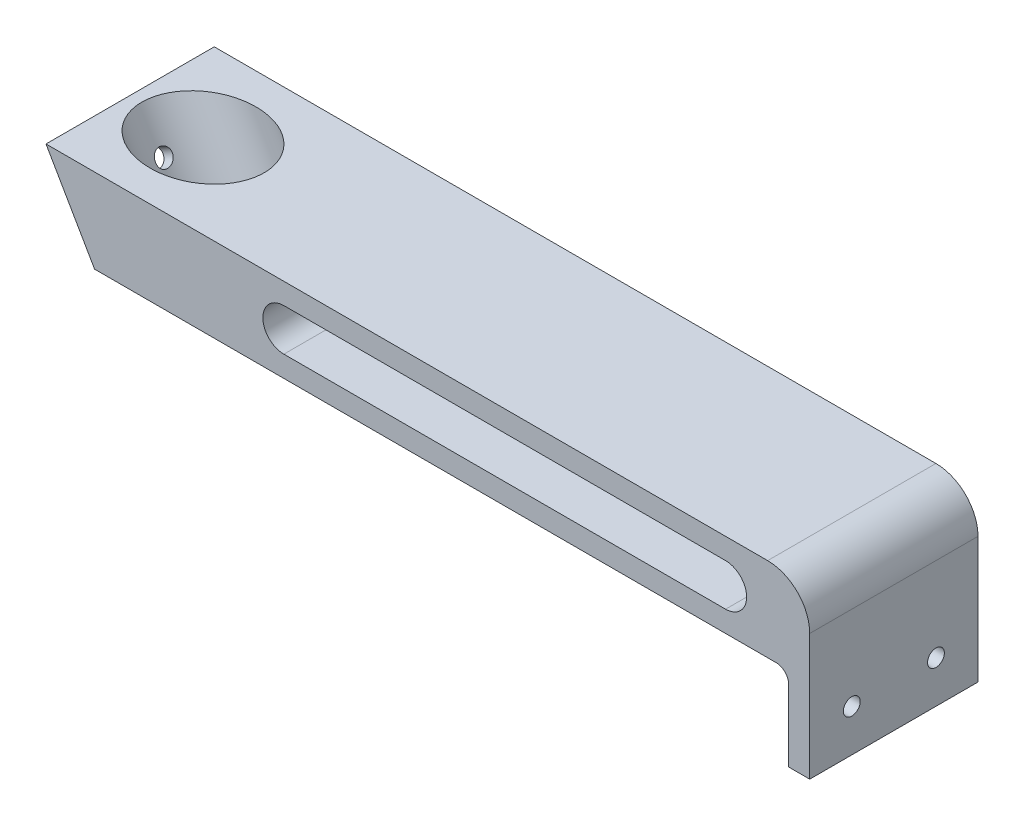
ISO-10303-21;
HEADER;
FILE_DESCRIPTION(('STEP AP214'),'2;1');
FILE_NAME('part.step','',(''),(''),'','','');
FILE_SCHEMA(('AUTOMOTIVE_DESIGN { 1 0 10303 214 1 1 1 1 }'));
ENDSEC;
DATA;
#1=APPLICATION_CONTEXT('core data for automotive mechanical design processes');
#2=APPLICATION_PROTOCOL_DEFINITION('international standard','automotive_design',2000,#1);
#3=PRODUCT_CONTEXT('',#1,'mechanical');
#4=PRODUCT('Part','Part','',(#3));
#5=PRODUCT_RELATED_PRODUCT_CATEGORY('part','',(#4));
#6=PRODUCT_DEFINITION_FORMATION('','',#4);
#7=PRODUCT_DEFINITION_CONTEXT('part definition',#1,'design');
#8=PRODUCT_DEFINITION('design','',#6,#7);
#9=PRODUCT_DEFINITION_SHAPE('','',#8);
#10=(LENGTH_UNIT() NAMED_UNIT(*) SI_UNIT(.MILLI.,.METRE.));
#11=(NAMED_UNIT(*) PLANE_ANGLE_UNIT() SI_UNIT($,.RADIAN.));
#12=(NAMED_UNIT(*) SI_UNIT($,.STERADIAN.) SOLID_ANGLE_UNIT());
#13=UNCERTAINTY_MEASURE_WITH_UNIT(LENGTH_MEASURE(1.E-05),#10,'distance_accuracy_value','');
#14=(GEOMETRIC_REPRESENTATION_CONTEXT(3) GLOBAL_UNCERTAINTY_ASSIGNED_CONTEXT((#13)) GLOBAL_UNIT_ASSIGNED_CONTEXT((#10,
#11,#12)) REPRESENTATION_CONTEXT('',''));
#15=CARTESIAN_POINT('',(0.,0.,0.));
#16=DIRECTION('',(0.,0.,1.));
#17=DIRECTION('',(1.,0.,0.));
#18=AXIS2_PLACEMENT_3D('',#15,#16,#17);
#19=CARTESIAN_POINT('',(0.,0.,40.));
#20=DIRECTION('',(0.,1.,0.));
#21=DIRECTION('',(0.,0.,1.));
#22=AXIS2_PLACEMENT_3D('',#19,#20,#21);
#23=PLANE('',#22);
#24=CARTESIAN_POINT('',(17.3205080756887,0.,20.));
#25=DIRECTION('',(0.,1.,0.));
#26=DIRECTION('',(-1.,0.,0.));
#27=AXIS2_PLACEMENT_3D('',#24,#25,#26);
#28=ELLIPSE('',#27,14.5492267835785,12.6);
#29=CARTESIAN_POINT('',(2.77128129211019,0.,20.));
#30=VERTEX_POINT('',#29);
#31=EDGE_CURVE('E228',#30,#30,#28,.T.);
#32=ORIENTED_EDGE('',*,*,#31,.T.);
#33=EDGE_LOOP('',(#32));
#34=FACE_BOUND('',#33,.T.);
#35=DIRECTION('',(1.,0.,0.));
#36=VECTOR('',#35,1.);
#37=CARTESIAN_POINT('',(0.,0.,0.));
#38=LINE('',#37,#36);
#39=CARTESIAN_POINT('',(0.,0.,0.));
#40=VERTEX_POINT('',#39);
#41=CARTESIAN_POINT('',(162.,0.,0.));
#42=VERTEX_POINT('',#41);
#43=EDGE_CURVE('E312',#40,#42,#38,.T.);
#44=ORIENTED_EDGE('',*,*,#43,.T.);
#45=DIRECTION('',(0.,0.,-1.));
#46=VECTOR('',#45,1.);
#47=CARTESIAN_POINT('',(162.,0.,40.));
#48=LINE('',#47,#46);
#49=CARTESIAN_POINT('',(162.,0.,40.));
#50=VERTEX_POINT('',#49);
#51=EDGE_CURVE('E299',#42,#50,#48,.F.);
#52=ORIENTED_EDGE('',*,*,#51,.T.);
#53=DIRECTION('',(1.,0.,0.));
#54=VECTOR('',#53,1.);
#55=CARTESIAN_POINT('',(0.,0.,40.));
#56=LINE('',#55,#54);
#57=CARTESIAN_POINT('',(0.,0.,40.));
#58=VERTEX_POINT('',#57);
#59=EDGE_CURVE('E331',#58,#50,#56,.T.);
#60=ORIENTED_EDGE('',*,*,#59,.F.);
#61=DIRECTION('',(0.,0.,-1.));
#62=VECTOR('',#61,1.);
#63=CARTESIAN_POINT('',(0.,0.,40.));
#64=LINE('',#63,#62);
#65=EDGE_CURVE('E320',#58,#40,#64,.T.);
#66=ORIENTED_EDGE('',*,*,#65,.T.);
#67=EDGE_LOOP('',(#44,#52,#60,#66));
#68=FACE_BOUND('',#67,.T.);
#69=ADVANCED_FACE('F39',(#34,#68),#23,.F.);
#70=CARTESIAN_POINT('',(-11.5470053837923,20.,40.));
#71=DIRECTION('',(0.866025403784442,0.499999999999995,0.));
#72=DIRECTION('',(-0.499999999999995,0.866025403784442,0.));
#73=AXIS2_PLACEMENT_3D('',#70,#71,#72);
#74=PLANE('',#73);
#75=CARTESIAN_POINT('',(-5.73361648017728,9.93091505478142,20.));
#76=DIRECTION('',(-0.866025403784442,-0.499999999999995,0.));
#77=DIRECTION('',(0.499999999999995,-0.866025403784442,0.));
#78=AXIS2_PLACEMENT_3D('',#75,#76,#77);
#79=CIRCLE('',#78,2.);
#80=CARTESIAN_POINT('',(-4.73361648017729,8.19886424721254,20.));
#81=VERTEX_POINT('',#80);
#82=EDGE_CURVE('E214',#81,#81,#79,.T.);
#83=ORIENTED_EDGE('',*,*,#82,.F.);
#84=EDGE_LOOP('',(#83));
#85=FACE_BOUND('',#84,.T.);
#86=DIRECTION('',(0.499999999999995,-0.866025403784442,0.));
#87=VECTOR('',#86,1.);
#88=CARTESIAN_POINT('',(-11.5470053837923,20.,0.));
#89=LINE('',#88,#87);
#90=CARTESIAN_POINT('',(-11.5470053837923,20.,0.));
#91=VERTEX_POINT('',#90);
#92=EDGE_CURVE('E324',#91,#40,#89,.T.);
#93=ORIENTED_EDGE('',*,*,#92,.T.);
#94=ORIENTED_EDGE('',*,*,#65,.F.);
#95=DIRECTION('',(0.499999999999995,-0.866025403784442,0.));
#96=VECTOR('',#95,1.);
#97=CARTESIAN_POINT('',(-11.5470053837923,20.,40.));
#98=LINE('',#97,#96);
#99=CARTESIAN_POINT('',(-11.5470053837923,20.,40.));
#100=VERTEX_POINT('',#99);
#101=EDGE_CURVE('E343',#100,#58,#98,.T.);
#102=ORIENTED_EDGE('',*,*,#101,.F.);
#103=DIRECTION('',(0.,0.,-1.));
#104=VECTOR('',#103,1.);
#105=CARTESIAN_POINT('',(-11.5470053837923,20.,40.));
#106=LINE('',#105,#104);
#107=EDGE_CURVE('E341',#100,#91,#106,.T.);
#108=ORIENTED_EDGE('',*,*,#107,.T.);
#109=EDGE_LOOP('',(#93,#94,#102,#108));
#110=FACE_BOUND('',#109,.T.);
#111=ADVANCED_FACE('F265',(#85,#110),#74,.F.);
#112=CARTESIAN_POINT('',(170.,0.,40.));
#113=DIRECTION('',(-1.,0.,0.));
#114=DIRECTION('',(0.,0.,1.));
#115=AXIS2_PLACEMENT_3D('',#112,#113,#114);
#116=PLANE('',#115);
#117=CARTESIAN_POINT('',(170.,-10.,10.));
#118=DIRECTION('',(-1.,0.,0.));
#119=DIRECTION('',(0.,0.,1.));
#120=AXIS2_PLACEMENT_3D('',#117,#118,#119);
#121=CIRCLE('',#120,2.);
#122=CARTESIAN_POINT('',(170.,-10.,12.));
#123=VERTEX_POINT('',#122);
#124=EDGE_CURVE('E177',#123,#123,#121,.T.);
#125=ORIENTED_EDGE('',*,*,#124,.T.);
#126=EDGE_LOOP('',(#125));
#127=FACE_BOUND('',#126,.T.);
#128=CARTESIAN_POINT('',(170.,-10.,30.));
#129=DIRECTION('',(-1.,0.,0.));
#130=DIRECTION('',(0.,0.,-1.));
#131=AXIS2_PLACEMENT_3D('',#128,#129,#130);
#132=CIRCLE('',#131,2.);
#133=CARTESIAN_POINT('',(170.,-10.,28.));
#134=VERTEX_POINT('',#133);
#135=EDGE_CURVE('E186',#134,#134,#132,.T.);
#136=ORIENTED_EDGE('',*,*,#135,.T.);
#137=EDGE_LOOP('',(#136));
#138=FACE_BOUND('',#137,.T.);
#139=DIRECTION('',(0.,1.,0.));
#140=VECTOR('',#139,1.);
#141=CARTESIAN_POINT('',(170.,0.,0.));
#142=LINE('',#141,#140);
#143=CARTESIAN_POINT('',(170.,-20.,0.));
#144=VERTEX_POINT('',#143);
#145=CARTESIAN_POINT('',(170.,9.99999999999999,0.));
#146=VERTEX_POINT('',#145);
#147=EDGE_CURVE('E323',#144,#146,#142,.T.);
#148=ORIENTED_EDGE('',*,*,#147,.T.);
#149=DIRECTION('',(0.,0.,-1.));
#150=VECTOR('',#149,1.);
#151=CARTESIAN_POINT('',(170.,9.99999999999999,40.));
#152=LINE('',#151,#150);
#153=CARTESIAN_POINT('',(170.,9.99999999999999,40.));
#154=VERTEX_POINT('',#153);
#155=EDGE_CURVE('E288',#146,#154,#152,.F.);
#156=ORIENTED_EDGE('',*,*,#155,.T.);
#157=DIRECTION('',(0.,1.,0.));
#158=VECTOR('',#157,1.);
#159=CARTESIAN_POINT('',(170.,0.,40.));
#160=LINE('',#159,#158);
#161=CARTESIAN_POINT('',(170.,-20.,40.));
#162=VERTEX_POINT('',#161);
#163=EDGE_CURVE('E334',#162,#154,#160,.T.);
#164=ORIENTED_EDGE('',*,*,#163,.F.);
#165=DIRECTION('',(0.,0.,1.));
#166=VECTOR('',#165,1.);
#167=CARTESIAN_POINT('',(170.,-20.,40.));
#168=LINE('',#167,#166);
#169=EDGE_CURVE('E181',#144,#162,#168,.T.);
#170=ORIENTED_EDGE('',*,*,#169,.F.);
#171=EDGE_LOOP('',(#148,#156,#164,#170));
#172=FACE_BOUND('',#171,.T.);
#173=ADVANCED_FACE('F271',(#127,#138,#172),#116,.F.);
#174=CARTESIAN_POINT('',(170.,20.,40.));
#175=DIRECTION('',(0.,-1.,0.));
#176=DIRECTION('',(1.,0.,0.));
#177=AXIS2_PLACEMENT_3D('',#174,#175,#176);
#178=PLANE('',#177);
#179=CARTESIAN_POINT('',(5.77350269189636,20.,20.));
#180=DIRECTION('',(0.,-1.,0.));
#181=DIRECTION('',(-1.,0.,0.));
#182=AXIS2_PLACEMENT_3D('',#179,#180,#181);
#183=ELLIPSE('',#182,14.5492267835785,12.6);
#184=CARTESIAN_POINT('',(-8.77572409168216,20.,20.));
#185=VERTEX_POINT('',#184);
#186=EDGE_CURVE('E227',#185,#185,#183,.T.);
#187=ORIENTED_EDGE('',*,*,#186,.T.);
#188=EDGE_LOOP('',(#187));
#189=FACE_BOUND('',#188,.T.);
#190=DIRECTION('',(-1.,0.,0.));
#191=VECTOR('',#190,1.);
#192=CARTESIAN_POINT('',(170.,20.,40.));
#193=LINE('',#192,#191);
#194=CARTESIAN_POINT('',(160.,20.,40.));
#195=VERTEX_POINT('',#194);
#196=EDGE_CURVE('E337',#195,#100,#193,.T.);
#197=ORIENTED_EDGE('',*,*,#196,.F.);
#198=DIRECTION('',(0.,0.,-1.));
#199=VECTOR('',#198,1.);
#200=CARTESIAN_POINT('',(160.,20.,40.));
#201=LINE('',#200,#199);
#202=CARTESIAN_POINT('',(160.,20.,0.));
#203=VERTEX_POINT('',#202);
#204=EDGE_CURVE('E290',#195,#203,#201,.T.);
#205=ORIENTED_EDGE('',*,*,#204,.T.);
#206=DIRECTION('',(-1.,0.,0.));
#207=VECTOR('',#206,1.);
#208=CARTESIAN_POINT('',(170.,20.,0.));
#209=LINE('',#208,#207);
#210=EDGE_CURVE('E351',#203,#91,#209,.T.);
#211=ORIENTED_EDGE('',*,*,#210,.T.);
#212=ORIENTED_EDGE('',*,*,#107,.F.);
#213=EDGE_LOOP('',(#197,#205,#211,#212));
#214=FACE_BOUND('',#213,.T.);
#215=ADVANCED_FACE('F365',(#189,#214),#178,.F.);
#216=CARTESIAN_POINT('',(0.,0.,40.));
#217=DIRECTION('',(0.,0.,1.));
#218=DIRECTION('',(1.,0.,0.));
#219=AXIS2_PLACEMENT_3D('',#216,#217,#218);
#220=PLANE('',#219);
#221=CARTESIAN_POINT('',(150.,10.,40.));
#222=DIRECTION('',(0.,0.,-1.));
#223=DIRECTION('',(-1.,0.,0.));
#224=AXIS2_PLACEMENT_3D('',#221,#222,#223);
#225=CIRCLE('',#224,5.);
#226=CARTESIAN_POINT('',(150.,15.,40.));
#227=VERTEX_POINT('',#226);
#228=CARTESIAN_POINT('',(150.,5.,40.));
#229=VERTEX_POINT('',#228);
#230=EDGE_CURVE('E130',#227,#229,#225,.T.);
#231=ORIENTED_EDGE('',*,*,#230,.T.);
#232=DIRECTION('',(-1.,0.,0.));
#233=VECTOR('',#232,1.);
#234=CARTESIAN_POINT('',(150.,5.,40.));
#235=LINE('',#234,#233);
#236=CARTESIAN_POINT('',(45.,5.,40.));
#237=VERTEX_POINT('',#236);
#238=EDGE_CURVE('E140',#229,#237,#235,.T.);
#239=ORIENTED_EDGE('',*,*,#238,.T.);
#240=CARTESIAN_POINT('',(45.,10.,40.));
#241=DIRECTION('',(0.,0.,-1.));
#242=DIRECTION('',(-1.,0.,0.));
#243=AXIS2_PLACEMENT_3D('',#240,#241,#242);
#244=CIRCLE('',#243,5.);
#245=CARTESIAN_POINT('',(45.,15.,40.));
#246=VERTEX_POINT('',#245);
#247=EDGE_CURVE('E55',#237,#246,#244,.T.);
#248=ORIENTED_EDGE('',*,*,#247,.T.);
#249=DIRECTION('',(1.,0.,0.));
#250=VECTOR('',#249,1.);
#251=CARTESIAN_POINT('',(150.,15.,40.));
#252=LINE('',#251,#250);
#253=EDGE_CURVE('E137',#246,#227,#252,.T.);
#254=ORIENTED_EDGE('',*,*,#253,.T.);
#255=EDGE_LOOP('',(#231,#239,#248,#254));
#256=FACE_BOUND('',#255,.T.);
#257=ORIENTED_EDGE('',*,*,#163,.T.);
#258=CARTESIAN_POINT('',(160.,9.99999999999999,40.));
#259=DIRECTION('',(0.,0.,1.));
#260=DIRECTION('',(1.,0.,0.));
#261=AXIS2_PLACEMENT_3D('',#258,#259,#260);
#262=CIRCLE('',#261,10.);
#263=EDGE_CURVE('E287',#154,#195,#262,.T.);
#264=ORIENTED_EDGE('',*,*,#263,.T.);
#265=ORIENTED_EDGE('',*,*,#196,.T.);
#266=ORIENTED_EDGE('',*,*,#101,.T.);
#267=ORIENTED_EDGE('',*,*,#59,.T.);
#268=CARTESIAN_POINT('',(162.,-3.,40.));
#269=DIRECTION('',(0.,0.,1.));
#270=DIRECTION('',(1.,0.,0.));
#271=AXIS2_PLACEMENT_3D('',#268,#269,#270);
#272=CIRCLE('',#271,3.);
#273=CARTESIAN_POINT('',(165.,-3.,40.));
#274=VERTEX_POINT('',#273);
#275=EDGE_CURVE('E11',#50,#274,#272,.F.);
#276=ORIENTED_EDGE('',*,*,#275,.T.);
#277=DIRECTION('',(0.,1.,0.));
#278=VECTOR('',#277,1.);
#279=CARTESIAN_POINT('',(165.,-20.,40.));
#280=LINE('',#279,#278);
#281=CARTESIAN_POINT('',(165.,-20.,40.));
#282=VERTEX_POINT('',#281);
#283=EDGE_CURVE('E210',#282,#274,#280,.T.);
#284=ORIENTED_EDGE('',*,*,#283,.F.);
#285=DIRECTION('',(-1.,0.,0.));
#286=VECTOR('',#285,1.);
#287=CARTESIAN_POINT('',(170.,-20.,40.));
#288=LINE('',#287,#286);
#289=EDGE_CURVE('E196',#162,#282,#288,.T.);
#290=ORIENTED_EDGE('',*,*,#289,.F.);
#291=EDGE_LOOP('',(#257,#264,#265,#266,#267,#276,#284,#290));
#292=FACE_BOUND('',#291,.T.);
#293=ADVANCED_FACE('F145',(#256,#292),#220,.T.);
#294=CARTESIAN_POINT('',(0.,0.,0.));
#295=DIRECTION('',(0.,0.,1.));
#296=DIRECTION('',(1.,0.,0.));
#297=AXIS2_PLACEMENT_3D('',#294,#295,#296);
#298=PLANE('',#297);
#299=DIRECTION('',(-1.,0.,0.));
#300=VECTOR('',#299,1.);
#301=CARTESIAN_POINT('',(150.,5.,0.));
#302=LINE('',#301,#300);
#303=CARTESIAN_POINT('',(150.,5.,0.));
#304=VERTEX_POINT('',#303);
#305=CARTESIAN_POINT('',(45.,5.,0.));
#306=VERTEX_POINT('',#305);
#307=EDGE_CURVE('E162',#304,#306,#302,.T.);
#308=ORIENTED_EDGE('',*,*,#307,.F.);
#309=CARTESIAN_POINT('',(150.,10.,0.));
#310=DIRECTION('',(0.,0.,-1.));
#311=DIRECTION('',(-1.,0.,0.));
#312=AXIS2_PLACEMENT_3D('',#309,#310,#311);
#313=CIRCLE('',#312,5.);
#314=CARTESIAN_POINT('',(150.,15.,0.));
#315=VERTEX_POINT('',#314);
#316=EDGE_CURVE('E63',#315,#304,#313,.T.);
#317=ORIENTED_EDGE('',*,*,#316,.F.);
#318=DIRECTION('',(1.,0.,0.));
#319=VECTOR('',#318,1.);
#320=CARTESIAN_POINT('',(150.,15.,0.));
#321=LINE('',#320,#319);
#322=CARTESIAN_POINT('',(45.,15.,0.));
#323=VERTEX_POINT('',#322);
#324=EDGE_CURVE('E149',#323,#315,#321,.T.);
#325=ORIENTED_EDGE('',*,*,#324,.F.);
#326=CARTESIAN_POINT('',(45.,10.,0.));
#327=DIRECTION('',(0.,0.,-1.));
#328=DIRECTION('',(-1.,0.,0.));
#329=AXIS2_PLACEMENT_3D('',#326,#327,#328);
#330=CIRCLE('',#329,5.);
#331=EDGE_CURVE('E153',#306,#323,#330,.T.);
#332=ORIENTED_EDGE('',*,*,#331,.F.);
#333=EDGE_LOOP('',(#308,#317,#325,#332));
#334=FACE_BOUND('',#333,.T.);
#335=ORIENTED_EDGE('',*,*,#210,.F.);
#336=CARTESIAN_POINT('',(160.,9.99999999999999,0.));
#337=DIRECTION('',(0.,0.,1.));
#338=DIRECTION('',(1.,0.,0.));
#339=AXIS2_PLACEMENT_3D('',#336,#337,#338);
#340=CIRCLE('',#339,10.);
#341=EDGE_CURVE('E301',#203,#146,#340,.F.);
#342=ORIENTED_EDGE('',*,*,#341,.T.);
#343=ORIENTED_EDGE('',*,*,#147,.F.);
#344=DIRECTION('',(1.,0.,0.));
#345=VECTOR('',#344,1.);
#346=CARTESIAN_POINT('',(170.,-20.,0.));
#347=LINE('',#346,#345);
#348=CARTESIAN_POINT('',(165.,-20.,0.));
#349=VERTEX_POINT('',#348);
#350=EDGE_CURVE('E202',#349,#144,#347,.T.);
#351=ORIENTED_EDGE('',*,*,#350,.F.);
#352=DIRECTION('',(0.,1.,0.));
#353=VECTOR('',#352,1.);
#354=CARTESIAN_POINT('',(165.,-20.,0.));
#355=LINE('',#354,#353);
#356=CARTESIAN_POINT('',(165.,-3.,0.));
#357=VERTEX_POINT('',#356);
#358=EDGE_CURVE('E206',#349,#357,#355,.T.);
#359=ORIENTED_EDGE('',*,*,#358,.T.);
#360=CARTESIAN_POINT('',(162.,-3.,0.));
#361=DIRECTION('',(0.,0.,1.));
#362=DIRECTION('',(1.,0.,0.));
#363=AXIS2_PLACEMENT_3D('',#360,#361,#362);
#364=CIRCLE('',#363,3.);
#365=EDGE_CURVE('E48',#357,#42,#364,.T.);
#366=ORIENTED_EDGE('',*,*,#365,.T.);
#367=ORIENTED_EDGE('',*,*,#43,.F.);
#368=ORIENTED_EDGE('',*,*,#92,.F.);
#369=EDGE_LOOP('',(#335,#342,#343,#351,#359,#366,#367,#368));
#370=FACE_BOUND('',#369,.T.);
#371=ADVANCED_FACE('F310',(#334,#370),#298,.F.);
#372=CARTESIAN_POINT('',(55.4903810567658,-66.1121593216769,20.));
#373=DIRECTION('',(-0.499999999999995,0.866025403784441,0.));
#374=DIRECTION('',(-0.866025403784442,-0.499999999999995,0.));
#375=AXIS2_PLACEMENT_3D('',#372,#373,#374);
#376=CYLINDRICAL_SURFACE('',#375,12.6);
#377=CARTESIAN_POINT('',(-2.65515551109463,9.3988642472125,20.));
#378=CARTESIAN_POINT('',(-2.65515617263351,9.39886910642102,19.8884110189085));
#379=CARTESIAN_POINT('',(-2.65854361598251,9.40772837760714,19.7767592522315));
#380=CARTESIAN_POINT('',(-2.67210207812198,9.44286015156742,19.5565819973498));
#381=CARTESIAN_POINT('',(-2.68227951447211,9.46914912787507,19.448059568163));
#382=CARTESIAN_POINT('',(-2.70941006322254,9.53815426054945,19.2373587988238));
#383=CARTESIAN_POINT('',(-2.7263578386859,9.58085747686504,19.1351755347464));
#384=CARTESIAN_POINT('',(-2.76700341165708,9.68117535221202,18.9399009361862));
#385=CARTESIAN_POINT('',(-2.79070035662564,9.73878812781894,18.84680845537));
#386=CARTESIAN_POINT('',(-2.8449807938801,9.8674833664373,18.6715331404475));
#387=CARTESIAN_POINT('',(-2.8756164928099,9.9386672591791,18.5894409388171));
#388=CARTESIAN_POINT('',(-2.9434806941292,10.0918684100834,18.4392789204167));
#389=CARTESIAN_POINT('',(-2.98070959396639,10.1738863212604,18.3712099495227));
#390=CARTESIAN_POINT('',(-3.06160940724743,10.3466155384436,18.2506684333194));
#391=CARTESIAN_POINT('',(-3.10531493823253,10.4373725807755,18.1982845749981));
#392=CARTESIAN_POINT('',(-3.19835323399152,10.624312477359,18.1111672210578));
#393=CARTESIAN_POINT('',(-3.24768565454308,10.7204949995276,18.0764326464604));
#394=CARTESIAN_POINT('',(-3.35054035998495,10.9144717367748,18.0258834339799));
#395=CARTESIAN_POINT('',(-3.40402414093135,11.0122457374133,18.0099129474938));
#396=CARTESIAN_POINT('',(-3.51418998462214,11.2072471161249,17.9968622421099));
#397=CARTESIAN_POINT('',(-3.5708718417425,11.3044745289006,17.9997808100872));
#398=CARTESIAN_POINT('',(-3.68521829426349,11.4946949271177,18.0242982186534));
#399=CARTESIAN_POINT('',(-3.74286880860441,11.587718930135,18.0457227201328));
#400=CARTESIAN_POINT('',(-3.85778610996582,11.7680218881002,18.1063705709501));
#401=CARTESIAN_POINT('',(-3.91505288489029,11.8553006627081,18.1455944786979));
#402=CARTESIAN_POINT('',(-4.0274316585127,12.0223270812568,18.2409067020201));
#403=CARTESIAN_POINT('',(-4.08253312243333,12.1020400699858,18.2970681201976));
#404=CARTESIAN_POINT('',(-4.18824442017328,12.2516708547448,18.4246091686768));
#405=CARTESIAN_POINT('',(-4.23885392412684,12.3215879316326,18.4959899152981));
#406=CARTESIAN_POINT('',(-4.33410776138276,12.4508295050477,18.6528967359549));
#407=CARTESIAN_POINT('',(-4.37867878909302,12.5100263421207,18.738572543791));
#408=CARTESIAN_POINT('',(-4.45927595468607,12.6155720821,18.9211291436076));
#409=CARTESIAN_POINT('',(-4.49530204658425,12.6619209158649,19.018009995884));
#410=CARTESIAN_POINT('',(-4.55721473267159,12.7407973663403,19.2203597165755));
#411=CARTESIAN_POINT('',(-4.58309406695596,12.773315088433,19.325834669051));
#412=CARTESIAN_POINT('',(-4.62345377762398,12.823756409917,19.5423095317692));
#413=CARTESIAN_POINT('',(-4.63793501794686,12.8416811154161,19.6533090225912));
#414=CARTESIAN_POINT('',(-4.65470483736282,12.8624202220842,19.8764124539657));
#415=CARTESIAN_POINT('',(-4.6571219576478,12.8653939262004,19.9884919453398));
#416=CARTESIAN_POINT('',(-4.64999454683204,12.8565948545511,20.2116841478041));
#417=CARTESIAN_POINT('',(-4.64045043183725,12.8448225917665,20.3227968923899));
#418=CARTESIAN_POINT('',(-4.6099455694869,12.806901718054,20.5402827743277));
#419=CARTESIAN_POINT('',(-4.58904728400941,12.780831754693,20.6466784292705));
#420=CARTESIAN_POINT('',(-4.53684538535459,12.7149357723147,20.8524225678489));
#421=CARTESIAN_POINT('',(-4.50554123379007,12.6751090415344,20.9517706865305));
#422=CARTESIAN_POINT('',(-4.43362883656868,12.5821661197217,21.1414833541052));
#423=CARTESIAN_POINT('',(-4.39294747153736,12.5289451700744,21.2317688464869));
#424=CARTESIAN_POINT('',(-4.30417015366125,12.4105037409932,21.3999822329438));
#425=CARTESIAN_POINT('',(-4.25607371522232,12.3452824756352,21.47790931702));
#426=CARTESIAN_POINT('',(-4.15395208269306,12.2035786214447,21.6199367346048));
#427=CARTESIAN_POINT('',(-4.09987565053687,12.1269964232509,21.6839009483329));
#428=CARTESIAN_POINT('',(-3.98830638581511,11.9647905479074,21.7952384649653));
#429=CARTESIAN_POINT('',(-3.93081365404121,11.8791671374442,21.8426122570556));
#430=CARTESIAN_POINT('',(-3.8147876861958,11.7013336277952,21.9192169550327));
#431=CARTESIAN_POINT('',(-3.75625934988705,11.6091503597642,21.9485175073075));
#432=CARTESIAN_POINT('',(-3.63997875255966,11.4203503027407,21.9883644245748));
#433=CARTESIAN_POINT('',(-3.58222643126043,11.32373386072,21.9989122547294));
#434=CARTESIAN_POINT('',(-3.46994950939222,11.1299091428631,22.0009163773006));
#435=CARTESIAN_POINT('',(-3.41539583546113,11.032719854939,21.9925868073886));
#436=CARTESIAN_POINT('',(-3.31027226080015,10.8395144938792,21.9575335829559));
#437=CARTESIAN_POINT('',(-3.25970235048798,10.7434984179219,21.9308099726805));
#438=CARTESIAN_POINT('',(-3.16369896597518,10.5556107230338,21.8598062348964));
#439=CARTESIAN_POINT('',(-3.11826064508169,10.4637352435267,21.8155428546253));
#440=CARTESIAN_POINT('',(-3.03322272486052,10.2868245974424,21.7107376817023));
#441=CARTESIAN_POINT('',(-2.99362337067764,10.2017897181311,21.6501952058854));
#442=CARTESIAN_POINT('',(-2.92034059601926,10.0403257649601,21.513779411952));
#443=CARTESIAN_POINT('',(-2.8867254750265,9.96399922616541,21.4377480205004));
#444=CARTESIAN_POINT('',(-2.82619721897546,9.82348181595304,21.272846550815));
#445=CARTESIAN_POINT('',(-2.79928563720357,9.75929375798782,21.1839735045473));
#446=CARTESIAN_POINT('',(-2.7521474099404,9.64487842958318,20.9952584976341));
#447=CARTESIAN_POINT('',(-2.73196331295334,9.59474032516287,20.8953518512338));
#448=CARTESIAN_POINT('',(-2.6985689164068,9.51078634586613,20.6878912846268));
#449=CARTESIAN_POINT('',(-2.68535153425849,9.47695389713886,20.5803452576143));
#450=CARTESIAN_POINT('',(-2.66879290551266,9.43431190610206,20.3936242497986));
#451=CARTESIAN_POINT('',(-2.66367982710798,9.42104391981792,20.3155904481406));
#452=CARTESIAN_POINT('',(-2.65686092027416,9.40331843087593,20.1583816307427));
#453=CARTESIAN_POINT('',(-2.65515504152976,9.39886079811263,20.0792066318727));
#454=CARTESIAN_POINT('',(-2.65515551109463,9.3988642472125,20.));
#455=B_SPLINE_CURVE_WITH_KNOTS('',3,(#377,#378,#379,#380,#381,#382,#383,#384,#385,#386,#387,
#388,#389,#390,#391,#392,#393,#394,#395,#396,#397,#398,#399,#400,#401,#402,#403,#404,#405,#406,
#407,#408,#409,#410,#411,#412,#413,#414,#415,#416,#417,#418,#419,#420,#421,#422,#423,#424,#425,
#426,#427,#428,#429,#430,#431,#432,#433,#434,#435,#436,#437,#438,#439,#440,#441,#442,#443,#444,
#445,#446,#447,#448,#449,#450,#451,#452,#453,#454),.UNSPECIFIED.,.T.,.F.,(4,2,2,2,2,2,2,2,2,2,2,
2,2,2,2,2,2,2,2,2,2,2,2,2,2,2,2,2,2,2,2,2,2,2,2,2,2,2,4),(0.,0.334477466336173,0.66927151264264,
1.00380216593368,1.33829058082472,1.67538458184537,2.01249891030141,2.35148484447204,
2.6904500524486,3.02657956097152,3.36268748223101,3.69566313861028,4.02864924195285,
4.36309360239275,4.69756250237049,5.03578438965273,5.37400809703552,5.71247336044709,
6.05091296679829,6.38573874061528,6.72055286687822,7.05354348409705,7.38655133253866,
7.72224935562454,8.05796937205869,8.39682896551134,8.73567856648973,9.07321409491082,
9.41072325030864,9.74442302507608,10.0781219971595,10.411503113204,10.7448982220317,
11.0818835840601,11.418946956953,11.7581033603268,12.0969142979756,12.3343322269138,
12.5717466497954),.UNSPECIFIED.);
#456=CARTESIAN_POINT('',(-2.65515551109463,9.3988642472125,20.));
#457=VERTEX_POINT('',#456);
#458=EDGE_CURVE('E218',#457,#457,#455,.T.);
#459=ORIENTED_EDGE('',*,*,#458,.F.);
#460=EDGE_LOOP('',(#459));
#461=FACE_BOUND('',#460,.T.);
#462=ORIENTED_EDGE('',*,*,#186,.F.);
#463=EDGE_LOOP('',(#462));
#464=FACE_BOUND('',#463,.T.);
#465=ORIENTED_EDGE('',*,*,#31,.F.);
#466=EDGE_LOOP('',(#465));
#467=FACE_BOUND('',#466,.T.);
#468=ADVANCED_FACE('F386',(#461,#464,#467),#376,.F.);
#469=CARTESIAN_POINT('',(130.42782057037,88.54375738916,20.));
#470=DIRECTION('',(-0.866025403784442,-0.499999999999995,0.));
#471=DIRECTION('',(0.499999999999995,-0.866025403784442,0.));
#472=AXIS2_PLACEMENT_3D('',#469,#470,#471);
#473=CYLINDRICAL_SURFACE('',#472,2.);
#474=ORIENTED_EDGE('',*,*,#82,.T.);
#475=EDGE_LOOP('',(#474));
#476=FACE_BOUND('',#475,.T.);
#477=ORIENTED_EDGE('',*,*,#458,.T.);
#478=EDGE_LOOP('',(#477));
#479=FACE_BOUND('',#478,.T.);
#480=ADVANCED_FACE('F230',(#476,#479),#473,.F.);
#481=CARTESIAN_POINT('',(165.,-20.,40.));
#482=DIRECTION('',(1.,0.,0.));
#483=DIRECTION('',(0.,0.,-1.));
#484=AXIS2_PLACEMENT_3D('',#481,#482,#483);
#485=PLANE('',#484);
#486=CARTESIAN_POINT('',(165.,-10.,10.));
#487=DIRECTION('',(-1.,0.,0.));
#488=DIRECTION('',(0.,0.,1.));
#489=AXIS2_PLACEMENT_3D('',#486,#487,#488);
#490=CIRCLE('',#489,2.);
#491=CARTESIAN_POINT('',(165.,-10.,12.));
#492=VERTEX_POINT('',#491);
#493=EDGE_CURVE('E182',#492,#492,#490,.T.);
#494=ORIENTED_EDGE('',*,*,#493,.F.);
#495=EDGE_LOOP('',(#494));
#496=FACE_BOUND('',#495,.T.);
#497=CARTESIAN_POINT('',(165.,-10.,30.));
#498=DIRECTION('',(-1.,0.,0.));
#499=DIRECTION('',(0.,0.,-1.));
#500=AXIS2_PLACEMENT_3D('',#497,#498,#499);
#501=CIRCLE('',#500,2.);
#502=CARTESIAN_POINT('',(165.,-10.,28.));
#503=VERTEX_POINT('',#502);
#504=EDGE_CURVE('E171',#503,#503,#501,.T.);
#505=ORIENTED_EDGE('',*,*,#504,.F.);
#506=EDGE_LOOP('',(#505));
#507=FACE_BOUND('',#506,.T.);
#508=ORIENTED_EDGE('',*,*,#283,.T.);
#509=DIRECTION('',(0.,0.,-1.));
#510=VECTOR('',#509,1.);
#511=CARTESIAN_POINT('',(165.,-3.,0.));
#512=LINE('',#511,#510);
#513=EDGE_CURVE('E294',#274,#357,#512,.T.);
#514=ORIENTED_EDGE('',*,*,#513,.T.);
#515=ORIENTED_EDGE('',*,*,#358,.F.);
#516=DIRECTION('',(0.,0.,-1.));
#517=VECTOR('',#516,1.);
#518=CARTESIAN_POINT('',(165.,-20.,40.));
#519=LINE('',#518,#517);
#520=EDGE_CURVE('E199',#282,#349,#519,.T.);
#521=ORIENTED_EDGE('',*,*,#520,.F.);
#522=EDGE_LOOP('',(#508,#514,#515,#521));
#523=FACE_BOUND('',#522,.T.);
#524=ADVANCED_FACE('F235',(#496,#507,#523),#485,.F.);
#525=CARTESIAN_POINT('',(0.,-20.,0.));
#526=DIRECTION('',(0.,1.,0.));
#527=DIRECTION('',(0.,0.,1.));
#528=AXIS2_PLACEMENT_3D('',#525,#526,#527);
#529=PLANE('',#528);
#530=ORIENTED_EDGE('',*,*,#169,.T.);
#531=ORIENTED_EDGE('',*,*,#289,.T.);
#532=ORIENTED_EDGE('',*,*,#520,.T.);
#533=ORIENTED_EDGE('',*,*,#350,.T.);
#534=EDGE_LOOP('',(#530,#531,#532,#533));
#535=FACE_BOUND('',#534,.T.);
#536=ADVANCED_FACE('F238',(#535),#529,.F.);
#537=CARTESIAN_POINT('',(170.,-10.,30.));
#538=DIRECTION('',(-1.,0.,0.));
#539=DIRECTION('',(0.,0.,1.));
#540=AXIS2_PLACEMENT_3D('',#537,#538,#539);
#541=CYLINDRICAL_SURFACE('',#540,2.);
#542=ORIENTED_EDGE('',*,*,#135,.F.);
#543=EDGE_LOOP('',(#542));
#544=FACE_BOUND('',#543,.T.);
#545=ORIENTED_EDGE('',*,*,#504,.T.);
#546=EDGE_LOOP('',(#545));
#547=FACE_BOUND('',#546,.T.);
#548=ADVANCED_FACE('F242',(#544,#547),#541,.F.);
#549=CARTESIAN_POINT('',(170.,-10.,10.));
#550=DIRECTION('',(-1.,0.,0.));
#551=DIRECTION('',(0.,0.,1.));
#552=AXIS2_PLACEMENT_3D('',#549,#550,#551);
#553=CYLINDRICAL_SURFACE('',#552,2.);
#554=ORIENTED_EDGE('',*,*,#124,.F.);
#555=EDGE_LOOP('',(#554));
#556=FACE_BOUND('',#555,.T.);
#557=ORIENTED_EDGE('',*,*,#493,.T.);
#558=EDGE_LOOP('',(#557));
#559=FACE_BOUND('',#558,.T.);
#560=ADVANCED_FACE('F246',(#556,#559),#553,.F.);
#561=CARTESIAN_POINT('',(160.,9.99999999999999,40.));
#562=DIRECTION('',(0.,0.,-1.));
#563=DIRECTION('',(-1.,0.,0.));
#564=AXIS2_PLACEMENT_3D('',#561,#562,#563);
#565=CYLINDRICAL_SURFACE('',#564,10.);
#566=ORIENTED_EDGE('',*,*,#263,.F.);
#567=ORIENTED_EDGE('',*,*,#155,.F.);
#568=ORIENTED_EDGE('',*,*,#341,.F.);
#569=ORIENTED_EDGE('',*,*,#204,.F.);
#570=EDGE_LOOP('',(#566,#567,#568,#569));
#571=FACE_BOUND('',#570,.T.);
#572=ADVANCED_FACE('F250',(#571),#565,.T.);
#573=CARTESIAN_POINT('',(162.,-3.,40.));
#574=DIRECTION('',(0.,0.,1.));
#575=DIRECTION('',(1.,0.,0.));
#576=AXIS2_PLACEMENT_3D('',#573,#574,#575);
#577=CYLINDRICAL_SURFACE('',#576,3.);
#578=ORIENTED_EDGE('',*,*,#275,.F.);
#579=ORIENTED_EDGE('',*,*,#51,.F.);
#580=ORIENTED_EDGE('',*,*,#365,.F.);
#581=ORIENTED_EDGE('',*,*,#513,.F.);
#582=EDGE_LOOP('',(#578,#579,#580,#581));
#583=FACE_BOUND('',#582,.T.);
#584=ADVANCED_FACE('F41',(#583),#577,.F.);
#585=CARTESIAN_POINT('',(150.,10.,40.));
#586=DIRECTION('',(0.,0.,-1.));
#587=DIRECTION('',(-1.,0.,0.));
#588=AXIS2_PLACEMENT_3D('',#585,#586,#587);
#589=CYLINDRICAL_SURFACE('',#588,5.);
#590=ORIENTED_EDGE('',*,*,#316,.T.);
#591=DIRECTION('',(0.,0.,-1.));
#592=VECTOR('',#591,1.);
#593=CARTESIAN_POINT('',(150.,5.,40.));
#594=LINE('',#593,#592);
#595=EDGE_CURVE('E126',#229,#304,#594,.T.);
#596=ORIENTED_EDGE('',*,*,#595,.F.);
#597=ORIENTED_EDGE('',*,*,#230,.F.);
#598=DIRECTION('',(0.,0.,-1.));
#599=VECTOR('',#598,1.);
#600=CARTESIAN_POINT('',(150.,15.,40.));
#601=LINE('',#600,#599);
#602=EDGE_CURVE('E168',#227,#315,#601,.T.);
#603=ORIENTED_EDGE('',*,*,#602,.T.);
#604=EDGE_LOOP('',(#590,#596,#597,#603));
#605=FACE_BOUND('',#604,.T.);
#606=ADVANCED_FACE('F128',(#605),#589,.F.);
#607=CARTESIAN_POINT('',(150.,15.,40.));
#608=DIRECTION('',(0.,1.,0.));
#609=DIRECTION('',(0.,0.,1.));
#610=AXIS2_PLACEMENT_3D('',#607,#608,#609);
#611=PLANE('',#610);
#612=ORIENTED_EDGE('',*,*,#324,.T.);
#613=ORIENTED_EDGE('',*,*,#602,.F.);
#614=ORIENTED_EDGE('',*,*,#253,.F.);
#615=DIRECTION('',(0.,0.,-1.));
#616=VECTOR('',#615,1.);
#617=CARTESIAN_POINT('',(45.,15.,40.));
#618=LINE('',#617,#616);
#619=EDGE_CURVE('E172',#246,#323,#618,.T.);
#620=ORIENTED_EDGE('',*,*,#619,.T.);
#621=EDGE_LOOP('',(#612,#613,#614,#620));
#622=FACE_BOUND('',#621,.T.);
#623=ADVANCED_FACE('F254',(#622),#611,.F.);
#624=CARTESIAN_POINT('',(45.,10.,40.));
#625=DIRECTION('',(0.,0.,-1.));
#626=DIRECTION('',(-1.,0.,0.));
#627=AXIS2_PLACEMENT_3D('',#624,#625,#626);
#628=CYLINDRICAL_SURFACE('',#627,5.);
#629=ORIENTED_EDGE('',*,*,#331,.T.);
#630=ORIENTED_EDGE('',*,*,#619,.F.);
#631=ORIENTED_EDGE('',*,*,#247,.F.);
#632=DIRECTION('',(0.,0.,-1.));
#633=VECTOR('',#632,1.);
#634=CARTESIAN_POINT('',(45.,5.,40.));
#635=LINE('',#634,#633);
#636=EDGE_CURVE('E136',#237,#306,#635,.T.);
#637=ORIENTED_EDGE('',*,*,#636,.T.);
#638=EDGE_LOOP('',(#629,#630,#631,#637));
#639=FACE_BOUND('',#638,.T.);
#640=ADVANCED_FACE('F257',(#639),#628,.F.);
#641=CARTESIAN_POINT('',(150.,5.,40.));
#642=DIRECTION('',(0.,-1.,0.));
#643=DIRECTION('',(0.,0.,-1.));
#644=AXIS2_PLACEMENT_3D('',#641,#642,#643);
#645=PLANE('',#644);
#646=ORIENTED_EDGE('',*,*,#307,.T.);
#647=ORIENTED_EDGE('',*,*,#636,.F.);
#648=ORIENTED_EDGE('',*,*,#238,.F.);
#649=ORIENTED_EDGE('',*,*,#595,.T.);
#650=EDGE_LOOP('',(#646,#647,#648,#649));
#651=FACE_BOUND('',#650,.T.);
#652=ADVANCED_FACE('F141',(#651),#645,.F.);
#653=CLOSED_SHELL('',(#69,#111,#173,#215,#293,#371,#468,#480,#524,#536,#548,#560,#572,#584,#606,
#623,#640,#652));
#654=MANIFOLD_SOLID_BREP('B2',#653);
#655=ADVANCED_BREP_SHAPE_REPRESENTATION('',(#18,#654),#14);
#656=SHAPE_DEFINITION_REPRESENTATION(#9,#655);
ENDSEC;
END-ISO-10303-21;
